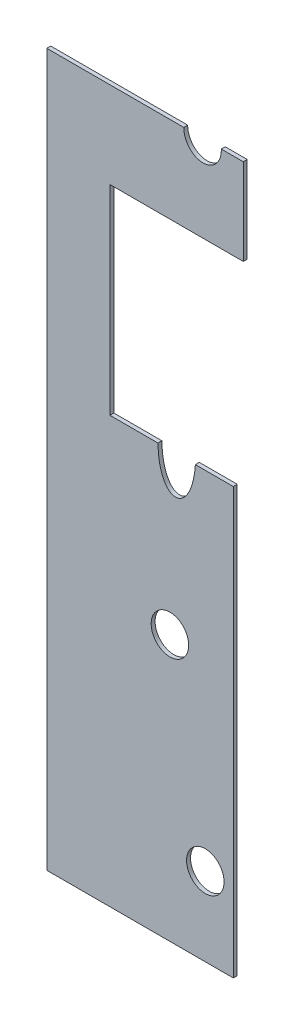
ISO-10303-21;
HEADER;
FILE_DESCRIPTION(('STEP AP214'),'2;1');
FILE_NAME('part.step','',(''),(''),'','','');
FILE_SCHEMA(('AUTOMOTIVE_DESIGN { 1 0 10303 214 1 1 1 1 }'));
ENDSEC;
DATA;
#1=APPLICATION_CONTEXT('core data for automotive mechanical design processes');
#2=APPLICATION_PROTOCOL_DEFINITION('international standard','automotive_design',2000,#1);
#3=PRODUCT_CONTEXT('',#1,'mechanical');
#4=PRODUCT('Part','Part','',(#3));
#5=PRODUCT_RELATED_PRODUCT_CATEGORY('part','',(#4));
#6=PRODUCT_DEFINITION_FORMATION('','',#4);
#7=PRODUCT_DEFINITION_CONTEXT('part definition',#1,'design');
#8=PRODUCT_DEFINITION('design','',#6,#7);
#9=PRODUCT_DEFINITION_SHAPE('','',#8);
#10=(LENGTH_UNIT() NAMED_UNIT(*) SI_UNIT(.MILLI.,.METRE.));
#11=(NAMED_UNIT(*) PLANE_ANGLE_UNIT() SI_UNIT($,.RADIAN.));
#12=(NAMED_UNIT(*) SI_UNIT($,.STERADIAN.) SOLID_ANGLE_UNIT());
#13=UNCERTAINTY_MEASURE_WITH_UNIT(LENGTH_MEASURE(1.E-05),#10,'distance_accuracy_value','');
#14=(GEOMETRIC_REPRESENTATION_CONTEXT(3) GLOBAL_UNCERTAINTY_ASSIGNED_CONTEXT((#13)) GLOBAL_UNIT_ASSIGNED_CONTEXT((#10,
#11,#12)) REPRESENTATION_CONTEXT('',''));
#15=CARTESIAN_POINT('',(0.,0.,0.));
#16=DIRECTION('',(0.,0.,1.));
#17=DIRECTION('',(1.,0.,0.));
#18=AXIS2_PLACEMENT_3D('',#15,#16,#17);
#19=CARTESIAN_POINT('',(0.,0.,3.));
#20=DIRECTION('',(0.,0.,1.));
#21=DIRECTION('',(1.,0.,0.));
#22=AXIS2_PLACEMENT_3D('',#19,#20,#21);
#23=PLANE('',#22);
#24=DIRECTION('',(0.,-1.,0.));
#25=VECTOR('',#24,1.);
#26=CARTESIAN_POINT('',(-175.26,324.552690863077,3.));
#27=LINE('',#26,#25);
#28=CARTESIAN_POINT('',(-175.26,324.552690863077,3.));
#29=VERTEX_POINT('',#28);
#30=CARTESIAN_POINT('',(-175.26,0.,3.));
#31=VERTEX_POINT('',#30);
#32=EDGE_CURVE('E198',#29,#31,#27,.T.);
#33=ORIENTED_EDGE('',*,*,#32,.F.);
#34=DIRECTION('',(1.,0.,0.));
#35=VECTOR('',#34,1.);
#36=CARTESIAN_POINT('',(-269.289310608568,324.552690863077,3.));
#37=LINE('',#36,#35);
#38=CARTESIAN_POINT('',(-204.205687114577,324.552690863077,3.));
#39=VERTEX_POINT('',#38);
#40=EDGE_CURVE('E402',#39,#29,#37,.T.);
#41=ORIENTED_EDGE('',*,*,#40,.F.);
#42=CARTESIAN_POINT('',(-219.536842198873,295.584667130981,3.));
#43=CARTESIAN_POINT('',(-219.189744783154,295.572085961771,3.));
#44=CARTESIAN_POINT('',(-218.493759947558,295.596307413235,3.));
#45=CARTESIAN_POINT('',(-217.004067861448,295.874303281346,3.));
#46=CARTESIAN_POINT('',(-215.051829480383,296.713460854425,3.));
#47=CARTESIAN_POINT('',(-212.6576447356,298.659157920563,3.));
#48=CARTESIAN_POINT('',(-210.284521534963,301.713908296137,3.));
#49=CARTESIAN_POINT('',(-208.03754656207,306.047064155738,3.));
#50=CARTESIAN_POINT('',(-206.096047082989,311.709746877015,3.));
#51=CARTESIAN_POINT('',(-204.683622036849,318.519958073049,3.));
#52=CARTESIAN_POINT('',(-203.999377661215,326.01729690017,3.));
#53=CARTESIAN_POINT('',(-204.139030554089,333.544499363488,3.));
#54=CARTESIAN_POINT('',(-205.054700207534,340.439096533105,3.));
#55=CARTESIAN_POINT('',(-206.581135198983,346.227480767588,3.));
#56=CARTESIAN_POINT('',(-208.508499765712,350.711943060809,3.));
#57=CARTESIAN_POINT('',(-210.654236124876,353.930487616883,3.));
#58=CARTESIAN_POINT('',(-212.901272523902,356.044414078892,3.));
#59=CARTESIAN_POINT('',(-214.787634089677,357.022708601069,3.));
#60=CARTESIAN_POINT('',(-216.253290430692,357.407826380651,3.));
#61=CARTESIAN_POINT('',(-217.291897671616,357.519645573113,3.));
#62=CARTESIAN_POINT('',(-218.335874925009,357.483313395916,3.));
#63=CARTESIAN_POINT('',(-219.825567011119,357.205317527804,3.));
#64=CARTESIAN_POINT('',(-221.777805392184,356.366159954727,3.));
#65=CARTESIAN_POINT('',(-224.171990136967,354.420462888588,3.));
#66=CARTESIAN_POINT('',(-226.545113337604,351.365712513015,3.));
#67=CARTESIAN_POINT('',(-228.792088310497,347.032556653414,3.));
#68=CARTESIAN_POINT('',(-230.733587789578,341.369873932136,3.));
#69=CARTESIAN_POINT('',(-232.146012835718,334.559662736103,3.));
#70=CARTESIAN_POINT('',(-232.830257211352,327.062323908981,3.));
#71=CARTESIAN_POINT('',(-232.690604318478,319.535121445663,3.));
#72=CARTESIAN_POINT('',(-231.774934665033,312.640524276046,3.));
#73=CARTESIAN_POINT('',(-230.248499673584,306.852140041563,3.));
#74=CARTESIAN_POINT('',(-228.321135106855,302.367677748342,3.));
#75=CARTESIAN_POINT('',(-226.175398747691,299.149133192269,3.));
#76=CARTESIAN_POINT('',(-223.928362348665,297.035206730259,3.));
#77=CARTESIAN_POINT('',(-222.04200078289,296.056912208081,3.));
#78=CARTESIAN_POINT('',(-220.576344441875,295.6717944285,3.));
#79=CARTESIAN_POINT('',(-219.883939614593,295.597248300192,3.));
#80=CARTESIAN_POINT('',(-219.536842198873,295.584667130981,3.));
#81=B_SPLINE_CURVE_WITH_KNOTS('',3,(#42,#43,#44,#45,#46,#47,#48,#49,#50,#51,#52,#53,#54,#55,#56,
#57,#58,#59,#60,#61,#62,#63,#64,#65,#66,#67,#68,#69,#70,#71,#72,#73,#74,#75,#76,#77,#78,#79,
#80),.UNSPECIFIED.,.T.,.F.,(4,1,1,1,1,1,1,1,1,1,1,1,1,1,1,1,1,1,1,1,1,1,1,1,1,1,1,1,1,1,1,1,1,1,
1,1,4),(0.,0.015625,0.03125,0.0625,0.09375,0.125,0.15625,0.1875,0.21875,0.25,0.28125,0.3125,
0.34375,0.375,0.40625,0.4375,0.46875,0.484375,0.5,0.515625,0.53125,0.5625,0.59375,0.625,0.65625,
0.6875,0.71875,0.75,0.78125,0.8125,0.84375,0.875,0.90625,0.9375,0.96875,0.984375,1.),.UNSPECIFIED.);
#82=CARTESIAN_POINT('',(-232.738229799983,324.552690881317,3.));
#83=VERTEX_POINT('',#82);
#84=EDGE_CURVE('E209',#83,#39,#81,.T.);
#85=ORIENTED_EDGE('',*,*,#84,.F.);
#86=CARTESIAN_POINT('',(-269.289310608568,324.552690863077,3.));
#87=VERTEX_POINT('',#86);
#88=EDGE_CURVE('E401',#87,#83,#37,.T.);
#89=ORIENTED_EDGE('',*,*,#88,.F.);
#90=DIRECTION('',(0.,-1.,0.));
#91=VECTOR('',#90,1.);
#92=CARTESIAN_POINT('',(-269.289310608568,476.952690863077,3.));
#93=LINE('',#92,#91);
#94=CARTESIAN_POINT('',(-269.289310608568,476.952690863077,3.));
#95=VERTEX_POINT('',#94);
#96=EDGE_CURVE('E405',#95,#87,#93,.T.);
#97=ORIENTED_EDGE('',*,*,#96,.F.);
#98=DIRECTION('',(-1.,0.,0.));
#99=VECTOR('',#98,1.);
#100=CARTESIAN_POINT('',(-167.64,476.952690863077,3.));
#101=LINE('',#100,#99);
#102=CARTESIAN_POINT('',(-167.64,476.952690863077,3.));
#103=VERTEX_POINT('',#102);
#104=EDGE_CURVE('E409',#103,#95,#101,.T.);
#105=ORIENTED_EDGE('',*,*,#104,.F.);
#106=DIRECTION('',(0.,-1.,0.));
#107=VECTOR('',#106,1.);
#108=CARTESIAN_POINT('',(-167.64,542.828420784413,3.));
#109=LINE('',#108,#107);
#110=CARTESIAN_POINT('',(-167.64,542.828420784413,3.));
#111=VERTEX_POINT('',#110);
#112=EDGE_CURVE('E178',#111,#103,#109,.T.);
#113=ORIENTED_EDGE('',*,*,#112,.F.);
#114=DIRECTION('',(1.,0.,0.));
#115=VECTOR('',#114,1.);
#116=CARTESIAN_POINT('',(-317.5,542.828420784413,3.));
#117=LINE('',#116,#115);
#118=CARTESIAN_POINT('',(-184.445310358166,542.828420784413,3.));
#119=VERTEX_POINT('',#118);
#120=EDGE_CURVE('E167',#119,#111,#117,.T.);
#121=ORIENTED_EDGE('',*,*,#120,.F.);
#122=CARTESIAN_POINT('',(-201.017925428967,557.94244809985,3.));
#123=CARTESIAN_POINT('',(-201.321522302272,557.898011959253,3.));
#124=CARTESIAN_POINT('',(-201.925688803856,557.78845691596,3.));
#125=CARTESIAN_POINT('',(-203.212558468858,557.456409260979,3.));
#126=CARTESIAN_POINT('',(-205.590268610443,556.542726103532,3.));
#127=CARTESIAN_POINT('',(-209.244843740973,553.99189284112,3.));
#128=CARTESIAN_POINT('',(-212.181627388579,549.138969159189,3.));
#129=CARTESIAN_POINT('',(-213.149413762514,544.213508752315,3.));
#130=CARTESIAN_POINT('',(-213.025309065618,540.303446798145,3.));
#131=CARTESIAN_POINT('',(-212.023617038657,536.521833446101,3.));
#132=CARTESIAN_POINT('',(-209.684831001728,532.080341516724,3.));
#133=CARTESIAN_POINT('',(-205.480429935542,528.272641669027,3.));
#134=CARTESIAN_POINT('',(-201.248106456377,526.876179107757,3.));
#135=CARTESIAN_POINT('',(-198.708280572787,526.682254094822,3.));
#136=CARTESIAN_POINT('',(-197.380229359345,526.732940921069,3.));
#137=CARTESIAN_POINT('',(-196.464897871892,526.835225199717,3.));
#138=CARTESIAN_POINT('',(-195.558648119516,526.999557764656,3.));
#139=CARTESIAN_POINT('',(-194.271778454514,527.331605419637,3.));
#140=CARTESIAN_POINT('',(-191.89406831293,528.245288577084,3.));
#141=CARTESIAN_POINT('',(-188.239493182399,530.796121839496,3.));
#142=CARTESIAN_POINT('',(-185.302709534794,535.649045521427,3.));
#143=CARTESIAN_POINT('',(-184.334923160858,540.574505928301,3.));
#144=CARTESIAN_POINT('',(-184.459027857754,544.484567882471,3.));
#145=CARTESIAN_POINT('',(-185.460719884715,548.266181234515,3.));
#146=CARTESIAN_POINT('',(-187.799505921645,552.707673163892,3.));
#147=CARTESIAN_POINT('',(-192.00390698783,556.515373011589,3.));
#148=CARTESIAN_POINT('',(-196.236230466995,557.91183557286,3.));
#149=CARTESIAN_POINT('',(-198.776056350585,558.105760585794,3.));
#150=CARTESIAN_POINT('',(-200.104107564027,558.055073759547,3.));
#151=CARTESIAN_POINT('',(-200.714328555662,557.986884240448,3.));
#152=CARTESIAN_POINT('',(-201.017925428967,557.94244809985,3.));
#153=B_SPLINE_CURVE_WITH_KNOTS('',3,(#122,#123,#124,#125,#126,#127,#128,#129,#130,#131,#132,
#133,#134,#135,#136,#137,#138,#139,#140,#141,#142,#143,#144,#145,#146,#147,#148,#149,#150,#151,
#152),.UNSPECIFIED.,.T.,.F.,(4,1,1,1,1,1,1,1,1,1,1,1,1,1,1,1,1,1,1,1,1,1,1,1,1,1,1,1,4),(0.,
0.015625,0.03125,0.0625,0.125,0.1875,0.21875,0.25,0.28125,0.3125,0.375,0.4375,0.46875,0.484375,
0.5,0.515625,0.53125,0.5625,0.625,0.6875,0.71875,0.75,0.78125,0.8125,0.875,0.9375,0.96875,
0.984375,1.),.UNSPECIFIED.);
#154=CARTESIAN_POINT('',(-213.06080502759,542.828420767919,3.));
#155=VERTEX_POINT('',#154);
#156=EDGE_CURVE('E148',#155,#119,#153,.T.);
#157=ORIENTED_EDGE('',*,*,#156,.F.);
#158=CARTESIAN_POINT('',(-317.5,542.828420784413,3.));
#159=VERTEX_POINT('',#158);
#160=EDGE_CURVE('E50',#159,#155,#117,.T.);
#161=ORIENTED_EDGE('',*,*,#160,.F.);
#162=DIRECTION('',(0.,-1.,0.));
#163=VECTOR('',#162,1.);
#164=CARTESIAN_POINT('',(-317.5,635.,3.));
#165=LINE('',#164,#163);
#166=CARTESIAN_POINT('',(-317.5,0.,3.));
#167=VERTEX_POINT('',#166);
#168=EDGE_CURVE('E138',#159,#167,#165,.T.);
#169=ORIENTED_EDGE('',*,*,#168,.T.);
#170=DIRECTION('',(1.,0.,0.));
#171=VECTOR('',#170,1.);
#172=CARTESIAN_POINT('',(-317.5,0.,3.));
#173=LINE('',#172,#171);
#174=EDGE_CURVE('E155',#167,#31,#173,.T.);
#175=ORIENTED_EDGE('',*,*,#174,.T.);
#176=EDGE_LOOP('',(#33,#41,#85,#89,#97,#105,#113,#121,#157,#161,#169,#175));
#177=FACE_BOUND('',#176,.T.);
#178=CARTESIAN_POINT('',(-223.6,187.879329929202,3.));
#179=CARTESIAN_POINT('',(-223.295662529477,187.879329929202,3.));
#180=CARTESIAN_POINT('',(-222.686987588429,187.898684149059,3.));
#181=CARTESIAN_POINT('',(-221.376000047927,188.03033238686,3.));
#182=CARTESIAN_POINT('',(-218.908777195804,188.549108164773,3.));
#183=CARTESIAN_POINT('',(-214.936941631435,190.400827249599,3.));
#184=CARTESIAN_POINT('',(-211.303556280391,194.506325059104,3.));
#185=CARTESIAN_POINT('',(-209.612254965236,198.975982739927,3.));
#186=CARTESIAN_POINT('',(-209.162622517382,202.653208286446,3.));
#187=CARTESIAN_POINT('',(-209.612254965236,206.330433832966,3.));
#188=CARTESIAN_POINT('',(-211.303556280391,210.800091513789,3.));
#189=CARTESIAN_POINT('',(-214.936941631435,214.905589323293,3.));
#190=CARTESIAN_POINT('',(-218.908777195804,216.757308408119,3.));
#191=CARTESIAN_POINT('',(-221.376000047927,217.276084186033,3.));
#192=CARTESIAN_POINT('',(-222.686987588429,217.407732423834,3.));
#193=CARTESIAN_POINT('',(-223.6,217.436763753619,3.));
#194=CARTESIAN_POINT('',(-224.513012411571,217.407732423834,3.));
#195=CARTESIAN_POINT('',(-225.823999952073,217.276084186033,3.));
#196=CARTESIAN_POINT('',(-228.291222804196,216.757308408119,3.));
#197=CARTESIAN_POINT('',(-232.263058368565,214.905589323293,3.));
#198=CARTESIAN_POINT('',(-235.896443719609,210.800091513789,3.));
#199=CARTESIAN_POINT('',(-237.587745034764,206.330433832966,3.));
#200=CARTESIAN_POINT('',(-238.037377482618,202.653208286446,3.));
#201=CARTESIAN_POINT('',(-237.587745034765,198.975982739927,3.));
#202=CARTESIAN_POINT('',(-235.896443719609,194.506325059104,3.));
#203=CARTESIAN_POINT('',(-232.263058368565,190.400827249599,3.));
#204=CARTESIAN_POINT('',(-228.291222804197,188.549108164773,3.));
#205=CARTESIAN_POINT('',(-225.823999952073,188.03033238686,3.));
#206=CARTESIAN_POINT('',(-224.513012411571,187.898684149059,3.));
#207=CARTESIAN_POINT('',(-223.904337470524,187.879329929202,3.));
#208=CARTESIAN_POINT('',(-223.6,187.879329929202,3.));
#209=B_SPLINE_CURVE_WITH_KNOTS('',3,(#178,#179,#180,#181,#182,#183,#184,#185,#186,#187,#188,
#189,#190,#191,#192,#193,#194,#195,#196,#197,#198,#199,#200,#201,#202,#203,#204,#205,#206,#207,
#208),.UNSPECIFIED.,.T.,.F.,(4,1,1,1,1,1,1,1,1,1,1,1,1,1,1,1,1,1,1,1,1,1,1,1,1,1,1,1,4),(0.,
0.015625,0.03125,0.0625,0.125,0.1875,0.21875,0.25,0.28125,0.3125,0.375,0.4375,0.46875,0.484375,
0.5,0.515625,0.53125,0.5625,0.625,0.6875,0.71875,0.75,0.78125,0.8125,0.875,0.9375,0.96875,
0.984375,1.),.UNSPECIFIED.);
#210=CARTESIAN_POINT('',(-223.6,187.879329929202,3.));
#211=VERTEX_POINT('',#210);
#212=EDGE_CURVE('E248',#211,#211,#209,.T.);
#213=ORIENTED_EDGE('',*,*,#212,.F.);
#214=EDGE_LOOP('',(#213));
#215=FACE_BOUND('',#214,.T.);
#216=CARTESIAN_POINT('',(-196.60000528246,74.6611792325774,3.));
#217=CARTESIAN_POINT('',(-196.904342752983,74.6611791883649,3.));
#218=CARTESIAN_POINT('',(-197.513017691219,74.641824880083,3.));
#219=CARTESIAN_POINT('',(-198.824005212596,74.5101764518285,3.));
#220=CARTESIAN_POINT('',(-201.291227989354,73.9914003154907,3.));
#221=CARTESIAN_POINT('',(-205.263063284716,72.1396806536579,3.));
#222=CARTESIAN_POINT('',(-208.896448039335,68.0341823163154,3.));
#223=CARTESIAN_POINT('',(-210.587748705163,63.564524389789,3.));
#224=CARTESIAN_POINT('',(-211.037380618809,59.8872987779495,3.));
#225=CARTESIAN_POINT('',(-210.587747636749,56.2100732967503,3.));
#226=CARTESIAN_POINT('',(-208.896445672265,51.74041586163,3.));
#227=CARTESIAN_POINT('',(-205.263059724798,47.6349185799643,3.));
#228=CARTESIAN_POINT('',(-201.291223891421,45.7832000721446,3.));
#229=CARTESIAN_POINT('',(-198.824000963933,45.2644246526561,3.));
#230=CARTESIAN_POINT('',(-197.513013404305,45.1327766053079,3.));
#231=CARTESIAN_POINT('',(-196.600000988517,45.1037454081599,3.));
#232=CARTESIAN_POINT('',(-195.686988581164,45.1327768705828,3.));
#233=CARTESIAN_POINT('',(-194.376001059787,45.2644252988372,3.));
#234=CARTESIAN_POINT('',(-191.908778283029,45.7832014351751,3.));
#235=CARTESIAN_POINT('',(-187.936942987667,47.6349210970078,3.));
#236=CARTESIAN_POINT('',(-184.303558233048,51.7404194343503,3.));
#237=CARTESIAN_POINT('',(-182.61225756722,56.2100773608767,3.));
#238=CARTESIAN_POINT('',(-182.162625653574,59.8873029727162,3.));
#239=CARTESIAN_POINT('',(-182.612258635634,63.5645284539154,3.));
#240=CARTESIAN_POINT('',(-184.303560600118,68.0341858890357,3.));
#241=CARTESIAN_POINT('',(-187.936946547585,72.1396831707015,3.));
#242=CARTESIAN_POINT('',(-191.908782380962,73.9914016785211,3.));
#243=CARTESIAN_POINT('',(-194.37600530845,74.5101770980096,3.));
#244=CARTESIAN_POINT('',(-195.686992868078,74.6418251453579,3.));
#245=CARTESIAN_POINT('',(-196.295667811936,74.6611792767899,3.));
#246=CARTESIAN_POINT('',(-196.60000528246,74.6611792325774,3.));
#247=B_SPLINE_CURVE_WITH_KNOTS('',3,(#216,#217,#218,#219,#220,#221,#222,#223,#224,#225,#226,
#227,#228,#229,#230,#231,#232,#233,#234,#235,#236,#237,#238,#239,#240,#241,#242,#243,#244,#245,
#246),.UNSPECIFIED.,.T.,.F.,(4,1,1,1,1,1,1,1,1,1,1,1,1,1,1,1,1,1,1,1,1,1,1,1,1,1,1,1,4),(0.,
0.015625,0.03125,0.0625,0.125,0.1875,0.21875,0.25,0.28125,0.3125,0.375,0.4375,0.46875,0.484375,
0.5,0.515625,0.53125,0.5625,0.625,0.6875,0.71875,0.75,0.78125,0.8125,0.875,0.9375,0.96875,
0.984375,1.),.UNSPECIFIED.);
#248=CARTESIAN_POINT('',(-196.60000528246,74.6611792325774,3.));
#249=VERTEX_POINT('',#248);
#250=EDGE_CURVE('E181',#249,#249,#247,.T.);
#251=ORIENTED_EDGE('',*,*,#250,.F.);
#252=EDGE_LOOP('',(#251));
#253=FACE_BOUND('',#252,.T.);
#254=ADVANCED_FACE('F36',(#177,#215,#253),#23,.T.);
#255=CARTESIAN_POINT('',(0.,0.,0.));
#256=DIRECTION('',(0.,0.,1.));
#257=DIRECTION('',(1.,0.,0.));
#258=AXIS2_PLACEMENT_3D('',#255,#256,#257);
#259=PLANE('',#258);
#260=DIRECTION('',(1.,0.,0.));
#261=VECTOR('',#260,1.);
#262=CARTESIAN_POINT('',(-269.289310608568,324.552690863077,0.));
#263=LINE('',#262,#261);
#264=CARTESIAN_POINT('',(-204.205687114577,324.552690881019,0.));
#265=VERTEX_POINT('',#264);
#266=CARTESIAN_POINT('',(-175.26,324.552690863077,0.));
#267=VERTEX_POINT('',#266);
#268=EDGE_CURVE('E58',#265,#267,#263,.T.);
#269=ORIENTED_EDGE('',*,*,#268,.T.);
#270=DIRECTION('',(0.,-1.,0.));
#271=VECTOR('',#270,1.);
#272=CARTESIAN_POINT('',(-175.26,324.552690863077,0.));
#273=LINE('',#272,#271);
#274=CARTESIAN_POINT('',(-175.26,0.,0.));
#275=VERTEX_POINT('',#274);
#276=EDGE_CURVE('E140',#267,#275,#273,.T.);
#277=ORIENTED_EDGE('',*,*,#276,.T.);
#278=DIRECTION('',(1.,0.,0.));
#279=VECTOR('',#278,1.);
#280=CARTESIAN_POINT('',(-317.5,0.,0.));
#281=LINE('',#280,#279);
#282=CARTESIAN_POINT('',(-317.5,0.,0.));
#283=VERTEX_POINT('',#282);
#284=EDGE_CURVE('E147',#283,#275,#281,.T.);
#285=ORIENTED_EDGE('',*,*,#284,.F.);
#286=DIRECTION('',(0.,-1.,0.));
#287=VECTOR('',#286,1.);
#288=CARTESIAN_POINT('',(-317.5,635.,0.));
#289=LINE('',#288,#287);
#290=CARTESIAN_POINT('',(-317.5,542.828420784413,0.));
#291=VERTEX_POINT('',#290);
#292=EDGE_CURVE('E136',#291,#283,#289,.T.);
#293=ORIENTED_EDGE('',*,*,#292,.F.);
#294=DIRECTION('',(1.,0.,0.));
#295=VECTOR('',#294,1.);
#296=CARTESIAN_POINT('',(-317.5,542.828420784413,0.));
#297=LINE('',#296,#295);
#298=CARTESIAN_POINT('',(-213.06080502759,542.828420784413,0.));
#299=VERTEX_POINT('',#298);
#300=EDGE_CURVE('E122',#291,#299,#297,.T.);
#301=ORIENTED_EDGE('',*,*,#300,.T.);
#302=CARTESIAN_POINT('',(-201.017925428967,557.94244809985,0.));
#303=CARTESIAN_POINT('',(-201.321522302272,557.898011959253,0.));
#304=CARTESIAN_POINT('',(-201.925688803856,557.78845691596,0.));
#305=CARTESIAN_POINT('',(-203.212558468858,557.456409260979,0.));
#306=CARTESIAN_POINT('',(-205.590268610443,556.542726103532,0.));
#307=CARTESIAN_POINT('',(-209.244843740973,553.99189284112,0.));
#308=CARTESIAN_POINT('',(-212.181627388579,549.138969159189,0.));
#309=CARTESIAN_POINT('',(-213.149413762514,544.213508752315,0.));
#310=CARTESIAN_POINT('',(-213.025309065618,540.303446798145,0.));
#311=CARTESIAN_POINT('',(-212.023617038657,536.521833446101,0.));
#312=CARTESIAN_POINT('',(-209.684831001728,532.080341516724,0.));
#313=CARTESIAN_POINT('',(-205.480429935542,528.272641669027,0.));
#314=CARTESIAN_POINT('',(-201.248106456377,526.876179107757,0.));
#315=CARTESIAN_POINT('',(-198.708280572787,526.682254094822,0.));
#316=CARTESIAN_POINT('',(-197.380229359345,526.732940921069,0.));
#317=CARTESIAN_POINT('',(-196.464897871892,526.835225199717,0.));
#318=CARTESIAN_POINT('',(-195.558648119516,526.999557764656,0.));
#319=CARTESIAN_POINT('',(-194.271778454514,527.331605419637,0.));
#320=CARTESIAN_POINT('',(-191.89406831293,528.245288577084,0.));
#321=CARTESIAN_POINT('',(-188.239493182399,530.796121839496,0.));
#322=CARTESIAN_POINT('',(-185.302709534794,535.649045521427,0.));
#323=CARTESIAN_POINT('',(-184.334923160858,540.574505928301,0.));
#324=CARTESIAN_POINT('',(-184.459027857754,544.484567882471,0.));
#325=CARTESIAN_POINT('',(-185.460719884715,548.266181234515,0.));
#326=CARTESIAN_POINT('',(-187.799505921645,552.707673163892,0.));
#327=CARTESIAN_POINT('',(-192.00390698783,556.515373011589,0.));
#328=CARTESIAN_POINT('',(-196.236230466995,557.91183557286,0.));
#329=CARTESIAN_POINT('',(-198.776056350585,558.105760585794,0.));
#330=CARTESIAN_POINT('',(-200.104107564027,558.055073759547,0.));
#331=CARTESIAN_POINT('',(-200.714328555662,557.986884240448,0.));
#332=CARTESIAN_POINT('',(-201.017925428967,557.94244809985,0.));
#333=B_SPLINE_CURVE_WITH_KNOTS('',3,(#302,#303,#304,#305,#306,#307,#308,#309,#310,#311,#312,
#313,#314,#315,#316,#317,#318,#319,#320,#321,#322,#323,#324,#325,#326,#327,#328,#329,#330,#331,
#332),.UNSPECIFIED.,.T.,.F.,(4,1,1,1,1,1,1,1,1,1,1,1,1,1,1,1,1,1,1,1,1,1,1,1,1,1,1,1,4),(0.,
0.015625,0.03125,0.0625,0.125,0.1875,0.21875,0.25,0.28125,0.3125,0.375,0.4375,0.46875,0.484375,
0.5,0.515625,0.53125,0.5625,0.625,0.6875,0.71875,0.75,0.78125,0.8125,0.875,0.9375,0.96875,
0.984375,1.),.UNSPECIFIED.);
#334=CARTESIAN_POINT('',(-184.445310358166,542.828420784413,0.));
#335=VERTEX_POINT('',#334);
#336=EDGE_CURVE('E152',#299,#335,#333,.T.);
#337=ORIENTED_EDGE('',*,*,#336,.T.);
#338=CARTESIAN_POINT('',(-167.64,542.828420784413,0.));
#339=VERTEX_POINT('',#338);
#340=EDGE_CURVE('E131',#335,#339,#297,.T.);
#341=ORIENTED_EDGE('',*,*,#340,.T.);
#342=DIRECTION('',(0.,-1.,0.));
#343=VECTOR('',#342,1.);
#344=CARTESIAN_POINT('',(-167.64,542.828420784413,0.));
#345=LINE('',#344,#343);
#346=CARTESIAN_POINT('',(-167.64,476.952690863077,0.));
#347=VERTEX_POINT('',#346);
#348=EDGE_CURVE('E130',#339,#347,#345,.T.);
#349=ORIENTED_EDGE('',*,*,#348,.T.);
#350=DIRECTION('',(-1.,0.,0.));
#351=VECTOR('',#350,1.);
#352=CARTESIAN_POINT('',(-167.64,476.952690863077,0.));
#353=LINE('',#352,#351);
#354=CARTESIAN_POINT('',(-269.289310608568,476.952690863077,0.));
#355=VERTEX_POINT('',#354);
#356=EDGE_CURVE('E420',#347,#355,#353,.T.);
#357=ORIENTED_EDGE('',*,*,#356,.T.);
#358=DIRECTION('',(0.,-1.,0.));
#359=VECTOR('',#358,1.);
#360=CARTESIAN_POINT('',(-269.289310608568,476.952690863077,0.));
#361=LINE('',#360,#359);
#362=CARTESIAN_POINT('',(-269.289310608568,324.552690863077,0.));
#363=VERTEX_POINT('',#362);
#364=EDGE_CURVE('E417',#355,#363,#361,.T.);
#365=ORIENTED_EDGE('',*,*,#364,.T.);
#366=CARTESIAN_POINT('',(-232.738229799983,324.552690863077,0.));
#367=VERTEX_POINT('',#366);
#368=EDGE_CURVE('E414',#363,#367,#263,.T.);
#369=ORIENTED_EDGE('',*,*,#368,.T.);
#370=CARTESIAN_POINT('',(-219.536842198873,295.584667130981,0.));
#371=CARTESIAN_POINT('',(-219.189744783154,295.572085961771,0.));
#372=CARTESIAN_POINT('',(-218.493759947558,295.596307413235,0.));
#373=CARTESIAN_POINT('',(-217.004067861448,295.874303281346,0.));
#374=CARTESIAN_POINT('',(-215.051829480383,296.713460854425,0.));
#375=CARTESIAN_POINT('',(-212.6576447356,298.659157920563,0.));
#376=CARTESIAN_POINT('',(-210.284521534963,301.713908296137,0.));
#377=CARTESIAN_POINT('',(-208.03754656207,306.047064155738,0.));
#378=CARTESIAN_POINT('',(-206.096047082989,311.709746877015,0.));
#379=CARTESIAN_POINT('',(-204.683622036849,318.519958073049,0.));
#380=CARTESIAN_POINT('',(-203.999377661215,326.01729690017,0.));
#381=CARTESIAN_POINT('',(-204.139030554089,333.544499363488,0.));
#382=CARTESIAN_POINT('',(-205.054700207534,340.439096533105,0.));
#383=CARTESIAN_POINT('',(-206.581135198983,346.227480767588,0.));
#384=CARTESIAN_POINT('',(-208.508499765712,350.711943060809,0.));
#385=CARTESIAN_POINT('',(-210.654236124876,353.930487616883,0.));
#386=CARTESIAN_POINT('',(-212.901272523902,356.044414078892,0.));
#387=CARTESIAN_POINT('',(-214.787634089677,357.022708601069,0.));
#388=CARTESIAN_POINT('',(-216.253290430692,357.407826380651,0.));
#389=CARTESIAN_POINT('',(-217.291897671616,357.519645573113,0.));
#390=CARTESIAN_POINT('',(-218.335874925009,357.483313395916,0.));
#391=CARTESIAN_POINT('',(-219.825567011119,357.205317527804,0.));
#392=CARTESIAN_POINT('',(-221.777805392184,356.366159954727,0.));
#393=CARTESIAN_POINT('',(-224.171990136967,354.420462888588,0.));
#394=CARTESIAN_POINT('',(-226.545113337604,351.365712513015,0.));
#395=CARTESIAN_POINT('',(-228.792088310497,347.032556653414,0.));
#396=CARTESIAN_POINT('',(-230.733587789578,341.369873932136,0.));
#397=CARTESIAN_POINT('',(-232.146012835718,334.559662736103,0.));
#398=CARTESIAN_POINT('',(-232.830257211352,327.062323908981,0.));
#399=CARTESIAN_POINT('',(-232.690604318478,319.535121445663,0.));
#400=CARTESIAN_POINT('',(-231.774934665033,312.640524276046,0.));
#401=CARTESIAN_POINT('',(-230.248499673584,306.852140041563,0.));
#402=CARTESIAN_POINT('',(-228.321135106855,302.367677748342,0.));
#403=CARTESIAN_POINT('',(-226.175398747691,299.149133192269,0.));
#404=CARTESIAN_POINT('',(-223.928362348665,297.035206730259,0.));
#405=CARTESIAN_POINT('',(-222.04200078289,296.056912208081,0.));
#406=CARTESIAN_POINT('',(-220.576344441875,295.6717944285,0.));
#407=CARTESIAN_POINT('',(-219.883939614593,295.597248300192,0.));
#408=CARTESIAN_POINT('',(-219.536842198873,295.584667130981,0.));
#409=B_SPLINE_CURVE_WITH_KNOTS('',3,(#370,#371,#372,#373,#374,#375,#376,#377,#378,#379,#380,
#381,#382,#383,#384,#385,#386,#387,#388,#389,#390,#391,#392,#393,#394,#395,#396,#397,#398,#399,
#400,#401,#402,#403,#404,#405,#406,#407,#408),.UNSPECIFIED.,.T.,.F.,(4,1,1,1,1,1,1,1,1,1,1,1,1,
1,1,1,1,1,1,1,1,1,1,1,1,1,1,1,1,1,1,1,1,1,1,1,4),(0.,0.015625,0.03125,0.0625,0.09375,0.125,
0.15625,0.1875,0.21875,0.25,0.28125,0.3125,0.34375,0.375,0.40625,0.4375,0.46875,0.484375,0.5,
0.515625,0.53125,0.5625,0.59375,0.625,0.65625,0.6875,0.71875,0.75,0.78125,0.8125,0.84375,0.875,
0.90625,0.9375,0.96875,0.984375,1.),.UNSPECIFIED.);
#410=EDGE_CURVE('E205',#367,#265,#409,.T.);
#411=ORIENTED_EDGE('',*,*,#410,.T.);
#412=EDGE_LOOP('',(#269,#277,#285,#293,#301,#337,#341,#349,#357,#365,#369,#411));
#413=FACE_BOUND('',#412,.T.);
#414=CARTESIAN_POINT('',(-196.60000528246,74.6611792325774,0.));
#415=CARTESIAN_POINT('',(-196.904342752983,74.6611791883649,0.));
#416=CARTESIAN_POINT('',(-197.513017691219,74.641824880083,0.));
#417=CARTESIAN_POINT('',(-198.824005212596,74.5101764518285,0.));
#418=CARTESIAN_POINT('',(-201.291227989354,73.9914003154907,0.));
#419=CARTESIAN_POINT('',(-205.263063284716,72.1396806536579,0.));
#420=CARTESIAN_POINT('',(-208.896448039335,68.0341823163154,0.));
#421=CARTESIAN_POINT('',(-210.587748705163,63.564524389789,0.));
#422=CARTESIAN_POINT('',(-211.037380618809,59.8872987779495,0.));
#423=CARTESIAN_POINT('',(-210.587747636749,56.2100732967503,0.));
#424=CARTESIAN_POINT('',(-208.896445672265,51.74041586163,0.));
#425=CARTESIAN_POINT('',(-205.263059724798,47.6349185799643,0.));
#426=CARTESIAN_POINT('',(-201.291223891421,45.7832000721446,0.));
#427=CARTESIAN_POINT('',(-198.824000963933,45.2644246526561,0.));
#428=CARTESIAN_POINT('',(-197.513013404305,45.1327766053079,0.));
#429=CARTESIAN_POINT('',(-196.600000988517,45.1037454081599,0.));
#430=CARTESIAN_POINT('',(-195.686988581164,45.1327768705828,0.));
#431=CARTESIAN_POINT('',(-194.376001059787,45.2644252988372,0.));
#432=CARTESIAN_POINT('',(-191.908778283029,45.7832014351751,0.));
#433=CARTESIAN_POINT('',(-187.936942987667,47.6349210970078,0.));
#434=CARTESIAN_POINT('',(-184.303558233048,51.7404194343503,0.));
#435=CARTESIAN_POINT('',(-182.61225756722,56.2100773608767,0.));
#436=CARTESIAN_POINT('',(-182.162625653574,59.8873029727162,0.));
#437=CARTESIAN_POINT('',(-182.612258635634,63.5645284539154,0.));
#438=CARTESIAN_POINT('',(-184.303560600118,68.0341858890357,0.));
#439=CARTESIAN_POINT('',(-187.936946547585,72.1396831707015,0.));
#440=CARTESIAN_POINT('',(-191.908782380962,73.9914016785211,0.));
#441=CARTESIAN_POINT('',(-194.37600530845,74.5101770980096,0.));
#442=CARTESIAN_POINT('',(-195.686992868078,74.6418251453579,0.));
#443=CARTESIAN_POINT('',(-196.295667811936,74.6611792767899,0.));
#444=CARTESIAN_POINT('',(-196.60000528246,74.6611792325774,0.));
#445=B_SPLINE_CURVE_WITH_KNOTS('',3,(#414,#415,#416,#417,#418,#419,#420,#421,#422,#423,#424,
#425,#426,#427,#428,#429,#430,#431,#432,#433,#434,#435,#436,#437,#438,#439,#440,#441,#442,#443,
#444),.UNSPECIFIED.,.T.,.F.,(4,1,1,1,1,1,1,1,1,1,1,1,1,1,1,1,1,1,1,1,1,1,1,1,1,1,1,1,4),(0.,
0.015625,0.03125,0.0625,0.125,0.1875,0.21875,0.25,0.28125,0.3125,0.375,0.4375,0.46875,0.484375,
0.5,0.515625,0.53125,0.5625,0.625,0.6875,0.71875,0.75,0.78125,0.8125,0.875,0.9375,0.96875,
0.984375,1.),.UNSPECIFIED.);
#446=CARTESIAN_POINT('',(-196.60000528246,74.6611792325774,0.));
#447=VERTEX_POINT('',#446);
#448=EDGE_CURVE('E184',#447,#447,#445,.T.);
#449=ORIENTED_EDGE('',*,*,#448,.T.);
#450=EDGE_LOOP('',(#449));
#451=FACE_BOUND('',#450,.T.);
#452=CARTESIAN_POINT('',(-223.6,187.879329929202,0.));
#453=CARTESIAN_POINT('',(-223.295662529477,187.879329929202,0.));
#454=CARTESIAN_POINT('',(-222.686987588429,187.898684149059,0.));
#455=CARTESIAN_POINT('',(-221.376000047927,188.03033238686,0.));
#456=CARTESIAN_POINT('',(-218.908777195804,188.549108164773,0.));
#457=CARTESIAN_POINT('',(-214.936941631435,190.400827249599,0.));
#458=CARTESIAN_POINT('',(-211.303556280391,194.506325059104,0.));
#459=CARTESIAN_POINT('',(-209.612254965236,198.975982739927,0.));
#460=CARTESIAN_POINT('',(-209.162622517382,202.653208286446,0.));
#461=CARTESIAN_POINT('',(-209.612254965236,206.330433832966,0.));
#462=CARTESIAN_POINT('',(-211.303556280391,210.800091513789,0.));
#463=CARTESIAN_POINT('',(-214.936941631435,214.905589323293,0.));
#464=CARTESIAN_POINT('',(-218.908777195804,216.757308408119,0.));
#465=CARTESIAN_POINT('',(-221.376000047927,217.276084186033,0.));
#466=CARTESIAN_POINT('',(-222.686987588429,217.407732423834,0.));
#467=CARTESIAN_POINT('',(-223.6,217.436763753619,0.));
#468=CARTESIAN_POINT('',(-224.513012411571,217.407732423834,0.));
#469=CARTESIAN_POINT('',(-225.823999952073,217.276084186033,0.));
#470=CARTESIAN_POINT('',(-228.291222804196,216.757308408119,0.));
#471=CARTESIAN_POINT('',(-232.263058368565,214.905589323293,0.));
#472=CARTESIAN_POINT('',(-235.896443719609,210.800091513789,0.));
#473=CARTESIAN_POINT('',(-237.587745034764,206.330433832966,0.));
#474=CARTESIAN_POINT('',(-238.037377482618,202.653208286446,0.));
#475=CARTESIAN_POINT('',(-237.587745034765,198.975982739927,0.));
#476=CARTESIAN_POINT('',(-235.896443719609,194.506325059104,0.));
#477=CARTESIAN_POINT('',(-232.263058368565,190.400827249599,0.));
#478=CARTESIAN_POINT('',(-228.291222804197,188.549108164773,0.));
#479=CARTESIAN_POINT('',(-225.823999952073,188.03033238686,0.));
#480=CARTESIAN_POINT('',(-224.513012411571,187.898684149059,0.));
#481=CARTESIAN_POINT('',(-223.904337470524,187.879329929202,0.));
#482=CARTESIAN_POINT('',(-223.6,187.879329929202,0.));
#483=B_SPLINE_CURVE_WITH_KNOTS('',3,(#452,#453,#454,#455,#456,#457,#458,#459,#460,#461,#462,
#463,#464,#465,#466,#467,#468,#469,#470,#471,#472,#473,#474,#475,#476,#477,#478,#479,#480,#481,
#482),.UNSPECIFIED.,.T.,.F.,(4,1,1,1,1,1,1,1,1,1,1,1,1,1,1,1,1,1,1,1,1,1,1,1,1,1,1,1,4),(0.,
0.015625,0.03125,0.0625,0.125,0.1875,0.21875,0.25,0.28125,0.3125,0.375,0.4375,0.46875,0.484375,
0.5,0.515625,0.53125,0.5625,0.625,0.6875,0.71875,0.75,0.78125,0.8125,0.875,0.9375,0.96875,
0.984375,1.),.UNSPECIFIED.);
#484=CARTESIAN_POINT('',(-223.6,187.879329929202,0.));
#485=VERTEX_POINT('',#484);
#486=EDGE_CURVE('E227',#485,#485,#483,.T.);
#487=ORIENTED_EDGE('',*,*,#486,.T.);
#488=EDGE_LOOP('',(#487));
#489=FACE_BOUND('',#488,.T.);
#490=ADVANCED_FACE('F143',(#413,#451,#489),#259,.F.);
#491=CARTESIAN_POINT('',(-317.5,635.,3.));
#492=DIRECTION('',(1.,0.,0.));
#493=DIRECTION('',(0.,1.,0.));
#494=AXIS2_PLACEMENT_3D('',#491,#492,#493);
#495=PLANE('',#494);
#496=ORIENTED_EDGE('',*,*,#168,.F.);
#497=DIRECTION('',(0.,0.,1.));
#498=VECTOR('',#497,1.);
#499=CARTESIAN_POINT('',(-317.5,542.828420784413,0.));
#500=LINE('',#499,#498);
#501=EDGE_CURVE('E125',#291,#159,#500,.T.);
#502=ORIENTED_EDGE('',*,*,#501,.F.);
#503=ORIENTED_EDGE('',*,*,#292,.T.);
#504=DIRECTION('',(0.,0.,-1.));
#505=VECTOR('',#504,1.);
#506=CARTESIAN_POINT('',(-317.5,0.,3.));
#507=LINE('',#506,#505);
#508=EDGE_CURVE('E158',#167,#283,#507,.T.);
#509=ORIENTED_EDGE('',*,*,#508,.F.);
#510=EDGE_LOOP('',(#496,#502,#503,#509));
#511=FACE_BOUND('',#510,.T.);
#512=ADVANCED_FACE('F38',(#511),#495,.F.);
#513=CARTESIAN_POINT('',(-317.5,0.,3.));
#514=DIRECTION('',(0.,1.,0.));
#515=DIRECTION('',(0.,0.,1.));
#516=AXIS2_PLACEMENT_3D('',#513,#514,#515);
#517=PLANE('',#516);
#518=ORIENTED_EDGE('',*,*,#284,.T.);
#519=DIRECTION('',(0.,0.,1.));
#520=VECTOR('',#519,1.);
#521=CARTESIAN_POINT('',(-175.26,0.,0.));
#522=LINE('',#521,#520);
#523=EDGE_CURVE('E202',#275,#31,#522,.T.);
#524=ORIENTED_EDGE('',*,*,#523,.T.);
#525=ORIENTED_EDGE('',*,*,#174,.F.);
#526=ORIENTED_EDGE('',*,*,#508,.T.);
#527=EDGE_LOOP('',(#518,#524,#525,#526));
#528=FACE_BOUND('',#527,.T.);
#529=ADVANCED_FACE('F201',(#528),#517,.F.);
#530=DIRECTION('',(0.,0.,-1.));
#531=VECTOR('',#530,1.);
#532=SURFACE_OF_LINEAR_EXTRUSION('',#153,#531);
#533=DIRECTION('',(0.,0.,-1.));
#534=VECTOR('',#533,1.);
#535=CARTESIAN_POINT('',(-213.06080502759,542.828420784413,3.));
#536=LINE('',#535,#534);
#537=EDGE_CURVE('E11',#155,#299,#536,.T.);
#538=ORIENTED_EDGE('',*,*,#537,.F.);
#539=ORIENTED_EDGE('',*,*,#156,.T.);
#540=DIRECTION('',(0.,0.,-1.));
#541=VECTOR('',#540,1.);
#542=CARTESIAN_POINT('',(-184.445310358214,542.828420784413,3.));
#543=LINE('',#542,#541);
#544=EDGE_CURVE('E44',#335,#119,#543,.F.);
#545=ORIENTED_EDGE('',*,*,#544,.F.);
#546=ORIENTED_EDGE('',*,*,#336,.F.);
#547=EDGE_LOOP('',(#538,#539,#545,#546));
#548=FACE_BOUND('',#547,.T.);
#549=ADVANCED_FACE('F180',(#548),#532,.T.);
#550=DIRECTION('',(0.,0.,-1.));
#551=VECTOR('',#550,1.);
#552=SURFACE_OF_LINEAR_EXTRUSION('',#247,#551);
#553=ORIENTED_EDGE('',*,*,#250,.T.);
#554=EDGE_LOOP('',(#553));
#555=FACE_BOUND('',#554,.T.);
#556=ORIENTED_EDGE('',*,*,#448,.F.);
#557=EDGE_LOOP('',(#556));
#558=FACE_BOUND('',#557,.T.);
#559=ADVANCED_FACE('F245',(#555,#558),#552,.T.);
#560=DIRECTION('',(0.,0.,-1.));
#561=VECTOR('',#560,1.);
#562=SURFACE_OF_LINEAR_EXTRUSION('',#209,#561);
#563=ORIENTED_EDGE('',*,*,#212,.T.);
#564=EDGE_LOOP('',(#563));
#565=FACE_BOUND('',#564,.T.);
#566=ORIENTED_EDGE('',*,*,#486,.F.);
#567=EDGE_LOOP('',(#566));
#568=FACE_BOUND('',#567,.T.);
#569=ADVANCED_FACE('F240',(#565,#568),#562,.T.);
#570=DIRECTION('',(0.,0.,-1.));
#571=VECTOR('',#570,1.);
#572=SURFACE_OF_LINEAR_EXTRUSION('',#81,#571);
#573=DIRECTION('',(0.,0.,-1.));
#574=VECTOR('',#573,1.);
#575=CARTESIAN_POINT('',(-204.205687115611,324.552690863077,3.));
#576=LINE('',#575,#574);
#577=EDGE_CURVE('E162',#265,#39,#576,.F.);
#578=ORIENTED_EDGE('',*,*,#577,.F.);
#579=ORIENTED_EDGE('',*,*,#410,.F.);
#580=DIRECTION('',(0.,0.,-1.));
#581=VECTOR('',#580,1.);
#582=CARTESIAN_POINT('',(-232.738229799983,324.552690863075,3.));
#583=LINE('',#582,#581);
#584=EDGE_CURVE('E160',#83,#367,#583,.T.);
#585=ORIENTED_EDGE('',*,*,#584,.F.);
#586=ORIENTED_EDGE('',*,*,#84,.T.);
#587=EDGE_LOOP('',(#578,#579,#585,#586));
#588=FACE_BOUND('',#587,.T.);
#589=ADVANCED_FACE('F235',(#588),#572,.T.);
#590=CARTESIAN_POINT('',(-269.289310608568,324.552690863077,0.));
#591=DIRECTION('',(0.,-1.,0.));
#592=DIRECTION('',(1.,0.,0.));
#593=AXIS2_PLACEMENT_3D('',#590,#591,#592);
#594=PLANE('',#593);
#595=ORIENTED_EDGE('',*,*,#584,.T.);
#596=ORIENTED_EDGE('',*,*,#368,.F.);
#597=DIRECTION('',(0.,0.,1.));
#598=VECTOR('',#597,1.);
#599=CARTESIAN_POINT('',(-269.289310608568,324.552690863077,0.));
#600=LINE('',#599,#598);
#601=EDGE_CURVE('E212',#363,#87,#600,.T.);
#602=ORIENTED_EDGE('',*,*,#601,.T.);
#603=ORIENTED_EDGE('',*,*,#88,.T.);
#604=EDGE_LOOP('',(#595,#596,#602,#603));
#605=FACE_BOUND('',#604,.T.);
#606=ADVANCED_FACE('F239',(#605),#594,.F.);
#607=CARTESIAN_POINT('',(-317.5,542.828420784413,0.));
#608=DIRECTION('',(0.,-1.,0.));
#609=DIRECTION('',(0.,0.,-1.));
#610=AXIS2_PLACEMENT_3D('',#607,#608,#609);
#611=PLANE('',#610);
#612=ORIENTED_EDGE('',*,*,#544,.T.);
#613=ORIENTED_EDGE('',*,*,#120,.T.);
#614=DIRECTION('',(0.,0.,1.));
#615=VECTOR('',#614,1.);
#616=CARTESIAN_POINT('',(-167.64,542.828420784413,0.));
#617=LINE('',#616,#615);
#618=EDGE_CURVE('E139',#339,#111,#617,.T.);
#619=ORIENTED_EDGE('',*,*,#618,.F.);
#620=ORIENTED_EDGE('',*,*,#340,.F.);
#621=EDGE_LOOP('',(#612,#613,#619,#620));
#622=FACE_BOUND('',#621,.T.);
#623=ADVANCED_FACE('F166',(#622),#611,.F.);
#624=CARTESIAN_POINT('',(-167.64,542.828420784413,0.));
#625=DIRECTION('',(-1.,0.,0.));
#626=DIRECTION('',(0.,0.,1.));
#627=AXIS2_PLACEMENT_3D('',#624,#625,#626);
#628=PLANE('',#627);
#629=ORIENTED_EDGE('',*,*,#112,.T.);
#630=DIRECTION('',(0.,0.,1.));
#631=VECTOR('',#630,1.);
#632=CARTESIAN_POINT('',(-167.64,476.952690863077,0.));
#633=LINE('',#632,#631);
#634=EDGE_CURVE('E220',#347,#103,#633,.T.);
#635=ORIENTED_EDGE('',*,*,#634,.F.);
#636=ORIENTED_EDGE('',*,*,#348,.F.);
#637=ORIENTED_EDGE('',*,*,#618,.T.);
#638=EDGE_LOOP('',(#629,#635,#636,#637));
#639=FACE_BOUND('',#638,.T.);
#640=ADVANCED_FACE('F347',(#639),#628,.F.);
#641=CARTESIAN_POINT('',(-167.64,476.952690863077,0.));
#642=DIRECTION('',(0.,1.,0.));
#643=DIRECTION('',(-1.,0.,0.));
#644=AXIS2_PLACEMENT_3D('',#641,#642,#643);
#645=PLANE('',#644);
#646=ORIENTED_EDGE('',*,*,#104,.T.);
#647=DIRECTION('',(0.,0.,1.));
#648=VECTOR('',#647,1.);
#649=CARTESIAN_POINT('',(-269.289310608568,476.952690863077,0.));
#650=LINE('',#649,#648);
#651=EDGE_CURVE('E218',#355,#95,#650,.T.);
#652=ORIENTED_EDGE('',*,*,#651,.F.);
#653=ORIENTED_EDGE('',*,*,#356,.F.);
#654=ORIENTED_EDGE('',*,*,#634,.T.);
#655=EDGE_LOOP('',(#646,#652,#653,#654));
#656=FACE_BOUND('',#655,.T.);
#657=ADVANCED_FACE('F354',(#656),#645,.F.);
#658=CARTESIAN_POINT('',(-269.289310608568,476.952690863077,0.));
#659=DIRECTION('',(-1.,0.,0.));
#660=DIRECTION('',(0.,0.,1.));
#661=AXIS2_PLACEMENT_3D('',#658,#659,#660);
#662=PLANE('',#661);
#663=ORIENTED_EDGE('',*,*,#96,.T.);
#664=ORIENTED_EDGE('',*,*,#601,.F.);
#665=ORIENTED_EDGE('',*,*,#364,.F.);
#666=ORIENTED_EDGE('',*,*,#651,.T.);
#667=EDGE_LOOP('',(#663,#664,#665,#666));
#668=FACE_BOUND('',#667,.T.);
#669=ADVANCED_FACE('F362',(#668),#662,.F.);
#670=ORIENTED_EDGE('',*,*,#577,.T.);
#671=ORIENTED_EDGE('',*,*,#40,.T.);
#672=DIRECTION('',(0.,0.,1.));
#673=VECTOR('',#672,1.);
#674=CARTESIAN_POINT('',(-175.26,324.552690863077,0.));
#675=LINE('',#674,#673);
#676=EDGE_CURVE('E206',#267,#29,#675,.T.);
#677=ORIENTED_EDGE('',*,*,#676,.F.);
#678=ORIENTED_EDGE('',*,*,#268,.F.);
#679=EDGE_LOOP('',(#670,#671,#677,#678));
#680=FACE_BOUND('',#679,.T.);
#681=ADVANCED_FACE('F340',(#680),#594,.F.);
#682=CARTESIAN_POINT('',(-175.26,324.552690863077,0.));
#683=DIRECTION('',(-1.,0.,0.));
#684=DIRECTION('',(0.,-1.,0.));
#685=AXIS2_PLACEMENT_3D('',#682,#683,#684);
#686=PLANE('',#685);
#687=ORIENTED_EDGE('',*,*,#32,.T.);
#688=ORIENTED_EDGE('',*,*,#523,.F.);
#689=ORIENTED_EDGE('',*,*,#276,.F.);
#690=ORIENTED_EDGE('',*,*,#676,.T.);
#691=EDGE_LOOP('',(#687,#688,#689,#690));
#692=FACE_BOUND('',#691,.T.);
#693=ADVANCED_FACE('F379',(#692),#686,.F.);
#694=ORIENTED_EDGE('',*,*,#537,.T.);
#695=ORIENTED_EDGE('',*,*,#300,.F.);
#696=ORIENTED_EDGE('',*,*,#501,.T.);
#697=ORIENTED_EDGE('',*,*,#160,.T.);
#698=EDGE_LOOP('',(#694,#695,#696,#697));
#699=FACE_BOUND('',#698,.T.);
#700=ADVANCED_FACE('F124',(#699),#611,.F.);
#701=CLOSED_SHELL('',(#254,#490,#512,#529,#549,#559,#569,#589,#606,#623,#640,#657,#669,#681,
#693,#700));
#702=MANIFOLD_SOLID_BREP('B2',#701);
#703=ADVANCED_BREP_SHAPE_REPRESENTATION('',(#18,#702),#14);
#704=SHAPE_DEFINITION_REPRESENTATION(#9,#703);
ENDSEC;
END-ISO-10303-21;
